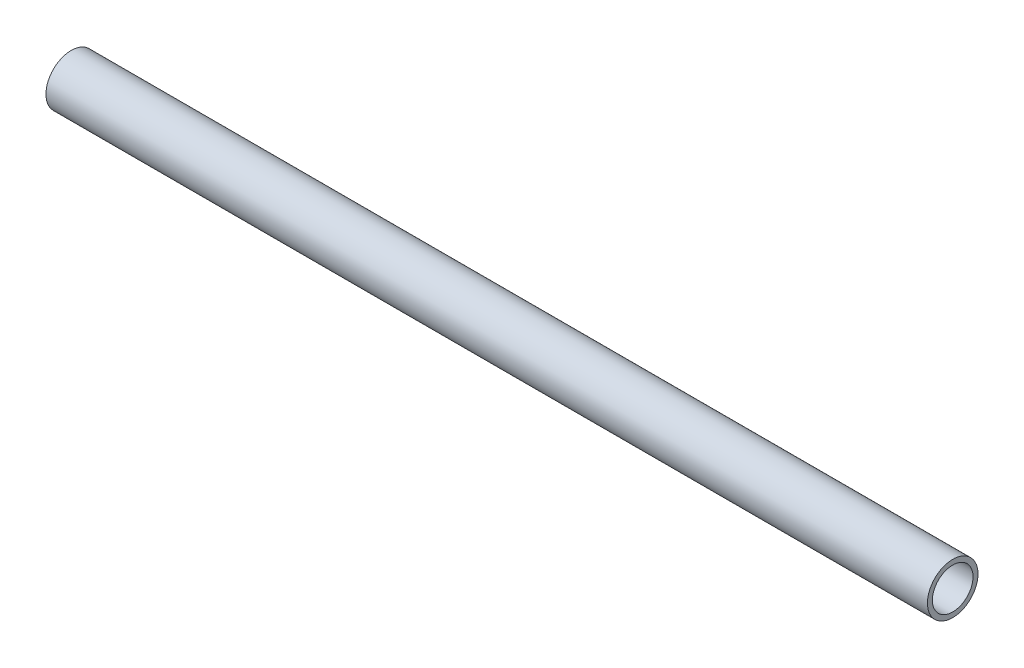
ISO-10303-21;
HEADER;
FILE_DESCRIPTION(('STEP AP214'),'2;1');
FILE_NAME('part.step','',(''),(''),'','','');
FILE_SCHEMA(('AUTOMOTIVE_DESIGN { 1 0 10303 214 1 1 1 1 }'));
ENDSEC;
DATA;
#1=APPLICATION_CONTEXT('core data for automotive mechanical design processes');
#2=APPLICATION_PROTOCOL_DEFINITION('international standard','automotive_design',2000,#1);
#3=PRODUCT_CONTEXT('',#1,'mechanical');
#4=PRODUCT('Part','Part','',(#3));
#5=PRODUCT_RELATED_PRODUCT_CATEGORY('part','',(#4));
#6=PRODUCT_DEFINITION_FORMATION('','',#4);
#7=PRODUCT_DEFINITION_CONTEXT('part definition',#1,'design');
#8=PRODUCT_DEFINITION('design','',#6,#7);
#9=PRODUCT_DEFINITION_SHAPE('','',#8);
#10=(LENGTH_UNIT() NAMED_UNIT(*) SI_UNIT(.MILLI.,.METRE.));
#11=(NAMED_UNIT(*) PLANE_ANGLE_UNIT() SI_UNIT($,.RADIAN.));
#12=(NAMED_UNIT(*) SI_UNIT($,.STERADIAN.) SOLID_ANGLE_UNIT());
#13=UNCERTAINTY_MEASURE_WITH_UNIT(LENGTH_MEASURE(1.E-05),#10,'distance_accuracy_value','');
#14=(GEOMETRIC_REPRESENTATION_CONTEXT(3) GLOBAL_UNCERTAINTY_ASSIGNED_CONTEXT((#13)) GLOBAL_UNIT_ASSIGNED_CONTEXT((#10,
#11,#12)) REPRESENTATION_CONTEXT('',''));
#15=CARTESIAN_POINT('',(0.,0.,0.));
#16=DIRECTION('',(0.,0.,1.));
#17=DIRECTION('',(1.,0.,0.));
#18=AXIS2_PLACEMENT_3D('',#15,#16,#17);
#19=CARTESIAN_POINT('',(88.9,0.,0.));
#20=DIRECTION('',(1.,0.,0.));
#21=DIRECTION('',(0.,0.,-1.));
#22=AXIS2_PLACEMENT_3D('',#19,#20,#21);
#23=PLANE('',#22);
#24=CARTESIAN_POINT('',(88.9,0.,0.));
#25=DIRECTION('',(1.,0.,0.));
#26=DIRECTION('',(0.,0.,-1.));
#27=AXIS2_PLACEMENT_3D('',#24,#25,#26);
#28=CIRCLE('',#27,2.55);
#29=CARTESIAN_POINT('',(88.9,0.,-2.55));
#30=VERTEX_POINT('',#29);
#31=EDGE_CURVE('E10',#30,#30,#28,.T.);
#32=ORIENTED_EDGE('',*,*,#31,.T.);
#33=EDGE_LOOP('',(#32));
#34=FACE_BOUND('',#33,.T.);
#35=CARTESIAN_POINT('',(88.9,0.,0.));
#36=DIRECTION('',(1.,0.,0.));
#37=DIRECTION('',(0.,0.,-1.));
#38=AXIS2_PLACEMENT_3D('',#35,#36,#37);
#39=CIRCLE('',#38,2.05);
#40=CARTESIAN_POINT('',(88.9,0.,-2.05));
#41=VERTEX_POINT('',#40);
#42=EDGE_CURVE('E50',#41,#41,#39,.T.);
#43=ORIENTED_EDGE('',*,*,#42,.F.);
#44=EDGE_LOOP('',(#43));
#45=FACE_BOUND('',#44,.T.);
#46=ADVANCED_FACE('F39',(#34,#45),#23,.T.);
#47=CARTESIAN_POINT('',(0.,0.,0.));
#48=DIRECTION('',(1.,0.,0.));
#49=DIRECTION('',(0.,0.,-1.));
#50=AXIS2_PLACEMENT_3D('',#47,#48,#49);
#51=PLANE('',#50);
#52=CARTESIAN_POINT('',(0.,0.,0.));
#53=DIRECTION('',(1.,0.,0.));
#54=DIRECTION('',(0.,0.,-1.));
#55=AXIS2_PLACEMENT_3D('',#52,#53,#54);
#56=CIRCLE('',#55,2.55);
#57=CARTESIAN_POINT('',(0.,0.,-2.55));
#58=VERTEX_POINT('',#57);
#59=EDGE_CURVE('E43',#58,#58,#56,.T.);
#60=ORIENTED_EDGE('',*,*,#59,.F.);
#61=EDGE_LOOP('',(#60));
#62=FACE_BOUND('',#61,.T.);
#63=CARTESIAN_POINT('',(0.,0.,0.));
#64=DIRECTION('',(1.,0.,0.));
#65=DIRECTION('',(0.,0.,-1.));
#66=AXIS2_PLACEMENT_3D('',#63,#64,#65);
#67=CIRCLE('',#66,2.05);
#68=CARTESIAN_POINT('',(0.,0.,-2.05));
#69=VERTEX_POINT('',#68);
#70=EDGE_CURVE('E52',#69,#69,#67,.T.);
#71=ORIENTED_EDGE('',*,*,#70,.T.);
#72=EDGE_LOOP('',(#71));
#73=FACE_BOUND('',#72,.T.);
#74=ADVANCED_FACE('F62',(#62,#73),#51,.F.);
#75=CARTESIAN_POINT('',(88.9,0.,0.));
#76=DIRECTION('',(-1.,0.,0.));
#77=DIRECTION('',(0.,0.,1.));
#78=AXIS2_PLACEMENT_3D('',#75,#76,#77);
#79=CYLINDRICAL_SURFACE('',#78,2.55);
#80=ORIENTED_EDGE('',*,*,#31,.F.);
#81=EDGE_LOOP('',(#80));
#82=FACE_BOUND('',#81,.T.);
#83=ORIENTED_EDGE('',*,*,#59,.T.);
#84=EDGE_LOOP('',(#83));
#85=FACE_BOUND('',#84,.T.);
#86=ADVANCED_FACE('F41',(#82,#85),#79,.T.);
#87=CARTESIAN_POINT('',(88.9,0.,0.));
#88=DIRECTION('',(-1.,0.,0.));
#89=DIRECTION('',(0.,0.,1.));
#90=AXIS2_PLACEMENT_3D('',#87,#88,#89);
#91=CYLINDRICAL_SURFACE('',#90,2.05);
#92=ORIENTED_EDGE('',*,*,#42,.T.);
#93=EDGE_LOOP('',(#92));
#94=FACE_BOUND('',#93,.T.);
#95=ORIENTED_EDGE('',*,*,#70,.F.);
#96=EDGE_LOOP('',(#95));
#97=FACE_BOUND('',#96,.T.);
#98=ADVANCED_FACE('F58',(#94,#97),#91,.F.);
#99=CLOSED_SHELL('',(#46,#74,#86,#98));
#100=MANIFOLD_SOLID_BREP('B2',#99);
#101=ADVANCED_BREP_SHAPE_REPRESENTATION('',(#18,#100),#14);
#102=SHAPE_DEFINITION_REPRESENTATION(#9,#101);
ENDSEC;
END-ISO-10303-21;
